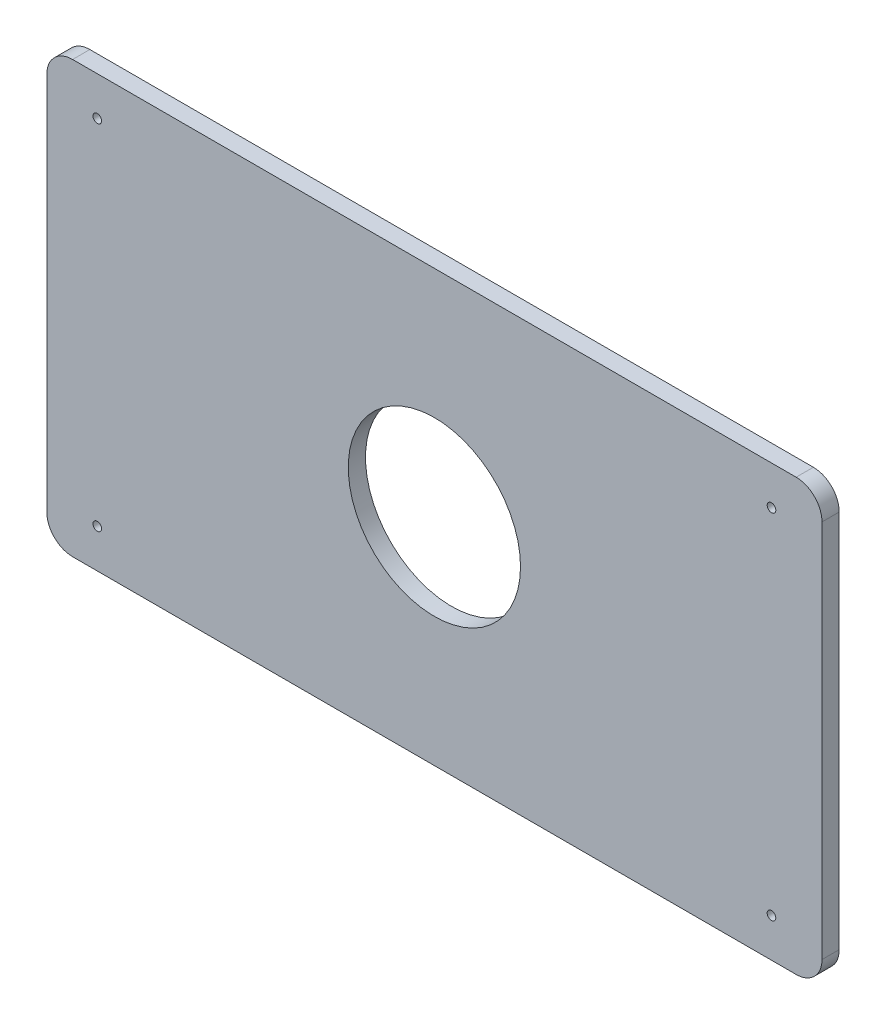
ISO-10303-21;
HEADER;
FILE_DESCRIPTION(('STEP AP214'),'2;1');
FILE_NAME('part.step','',(''),(''),'','','');
FILE_SCHEMA(('AUTOMOTIVE_DESIGN { 1 0 10303 214 1 1 1 1 }'));
ENDSEC;
DATA;
#1=APPLICATION_CONTEXT('core data for automotive mechanical design processes');
#2=APPLICATION_PROTOCOL_DEFINITION('international standard','automotive_design',2000,#1);
#3=PRODUCT_CONTEXT('',#1,'mechanical');
#4=PRODUCT('Part','Part','',(#3));
#5=PRODUCT_RELATED_PRODUCT_CATEGORY('part','',(#4));
#6=PRODUCT_DEFINITION_FORMATION('','',#4);
#7=PRODUCT_DEFINITION_CONTEXT('part definition',#1,'design');
#8=PRODUCT_DEFINITION('design','',#6,#7);
#9=PRODUCT_DEFINITION_SHAPE('','',#8);
#10=(LENGTH_UNIT() NAMED_UNIT(*) SI_UNIT(.MILLI.,.METRE.));
#11=(NAMED_UNIT(*) PLANE_ANGLE_UNIT() SI_UNIT($,.RADIAN.));
#12=(NAMED_UNIT(*) SI_UNIT($,.STERADIAN.) SOLID_ANGLE_UNIT());
#13=UNCERTAINTY_MEASURE_WITH_UNIT(LENGTH_MEASURE(1.E-05),#10,'distance_accuracy_value','');
#14=(GEOMETRIC_REPRESENTATION_CONTEXT(3) GLOBAL_UNCERTAINTY_ASSIGNED_CONTEXT((#13)) GLOBAL_UNIT_ASSIGNED_CONTEXT((#10,
#11,#12)) REPRESENTATION_CONTEXT('',''));
#15=CARTESIAN_POINT('',(0.,0.,0.));
#16=DIRECTION('',(0.,0.,1.));
#17=DIRECTION('',(1.,0.,0.));
#18=AXIS2_PLACEMENT_3D('',#15,#16,#17);
#19=CARTESIAN_POINT('',(435.,235.,10.));
#20=DIRECTION('',(0.,0.,-1.));
#21=DIRECTION('',(-1.,0.,0.));
#22=AXIS2_PLACEMENT_3D('',#19,#20,#21);
#23=PLANE('',#22);
#24=CARTESIAN_POINT('',(29.3181818181816,22.5,10.));
#25=DIRECTION('',(0.,0.,1.));
#26=DIRECTION('',(-1.,0.,0.));
#27=AXIS2_PLACEMENT_3D('',#24,#25,#26);
#28=CIRCLE('',#27,2.50000000000002);
#29=CARTESIAN_POINT('',(26.8181818181816,22.5,10.));
#30=VERTEX_POINT('',#29);
#31=EDGE_CURVE('E197',#30,#30,#28,.T.);
#32=ORIENTED_EDGE('',*,*,#31,.F.);
#33=EDGE_LOOP('',(#32));
#34=FACE_BOUND('',#33,.T.);
#35=CARTESIAN_POINT('',(29.3181818181817,227.5,10.));
#36=DIRECTION('',(0.,0.,1.));
#37=DIRECTION('',(-1.,0.,0.));
#38=AXIS2_PLACEMENT_3D('',#35,#36,#37);
#39=CIRCLE('',#38,2.50000000000002);
#40=CARTESIAN_POINT('',(26.8181818181817,227.5,10.));
#41=VERTEX_POINT('',#40);
#42=EDGE_CURVE('E203',#41,#41,#39,.T.);
#43=ORIENTED_EDGE('',*,*,#42,.F.);
#44=EDGE_LOOP('',(#43));
#45=FACE_BOUND('',#44,.T.);
#46=CARTESIAN_POINT('',(420.681818181818,227.5,10.));
#47=DIRECTION('',(0.,0.,1.));
#48=DIRECTION('',(1.,0.,0.));
#49=AXIS2_PLACEMENT_3D('',#46,#47,#48);
#50=CIRCLE('',#49,2.50000000000002);
#51=CARTESIAN_POINT('',(423.181818181818,227.5,10.));
#52=VERTEX_POINT('',#51);
#53=EDGE_CURVE('E209',#52,#52,#50,.T.);
#54=ORIENTED_EDGE('',*,*,#53,.F.);
#55=EDGE_LOOP('',(#54));
#56=FACE_BOUND('',#55,.T.);
#57=CARTESIAN_POINT('',(420.681818181818,22.4999999999999,10.));
#58=DIRECTION('',(0.,0.,1.));
#59=DIRECTION('',(1.,0.,0.));
#60=AXIS2_PLACEMENT_3D('',#57,#58,#59);
#61=CIRCLE('',#60,2.50000000000002);
#62=CARTESIAN_POINT('',(423.181818181818,22.4999999999999,10.));
#63=VERTEX_POINT('',#62);
#64=EDGE_CURVE('E191',#63,#63,#61,.T.);
#65=ORIENTED_EDGE('',*,*,#64,.F.);
#66=EDGE_LOOP('',(#65));
#67=FACE_BOUND('',#66,.T.);
#68=CARTESIAN_POINT('',(435.,235.,10.));
#69=DIRECTION('',(0.,0.,1.));
#70=DIRECTION('',(-1.,0.,0.));
#71=AXIS2_PLACEMENT_3D('',#68,#69,#70);
#72=CIRCLE('',#71,15.);
#73=CARTESIAN_POINT('',(450.,235.,10.));
#74=VERTEX_POINT('',#73);
#75=CARTESIAN_POINT('',(435.,250.,10.));
#76=VERTEX_POINT('',#75);
#77=EDGE_CURVE('E151',#74,#76,#72,.T.);
#78=ORIENTED_EDGE('',*,*,#77,.T.);
#79=DIRECTION('',(-1.,0.,0.));
#80=VECTOR('',#79,1.);
#81=CARTESIAN_POINT('',(15.,250.,10.));
#82=LINE('',#81,#80);
#83=CARTESIAN_POINT('',(15.,250.,10.));
#84=VERTEX_POINT('',#83);
#85=EDGE_CURVE('E99',#76,#84,#82,.T.);
#86=ORIENTED_EDGE('',*,*,#85,.T.);
#87=CARTESIAN_POINT('',(15.,235.,10.));
#88=DIRECTION('',(0.,0.,1.));
#89=DIRECTION('',(-1.,0.,0.));
#90=AXIS2_PLACEMENT_3D('',#87,#88,#89);
#91=CIRCLE('',#90,15.);
#92=CARTESIAN_POINT('',(0.,235.,10.));
#93=VERTEX_POINT('',#92);
#94=EDGE_CURVE('E166',#84,#93,#91,.T.);
#95=ORIENTED_EDGE('',*,*,#94,.T.);
#96=DIRECTION('',(0.,-1.,0.));
#97=VECTOR('',#96,1.);
#98=CARTESIAN_POINT('',(0.,15.0000000000001,10.));
#99=LINE('',#98,#97);
#100=CARTESIAN_POINT('',(0.,15.0000000000001,10.));
#101=VERTEX_POINT('',#100);
#102=EDGE_CURVE('E179',#93,#101,#99,.T.);
#103=ORIENTED_EDGE('',*,*,#102,.T.);
#104=CARTESIAN_POINT('',(15.,15.,10.));
#105=DIRECTION('',(0.,0.,1.));
#106=DIRECTION('',(-1.,0.,0.));
#107=AXIS2_PLACEMENT_3D('',#104,#105,#106);
#108=CIRCLE('',#107,15.);
#109=CARTESIAN_POINT('',(15.0000000000001,0.,10.));
#110=VERTEX_POINT('',#109);
#111=EDGE_CURVE('E118',#101,#110,#108,.T.);
#112=ORIENTED_EDGE('',*,*,#111,.T.);
#113=DIRECTION('',(1.,0.,0.));
#114=VECTOR('',#113,1.);
#115=CARTESIAN_POINT('',(15.0000000000001,0.,10.));
#116=LINE('',#115,#114);
#117=CARTESIAN_POINT('',(435.,0.,10.));
#118=VERTEX_POINT('',#117);
#119=EDGE_CURVE('E112',#110,#118,#116,.T.);
#120=ORIENTED_EDGE('',*,*,#119,.T.);
#121=CARTESIAN_POINT('',(435.,15.,10.));
#122=DIRECTION('',(0.,0.,1.));
#123=DIRECTION('',(1.,0.,0.));
#124=AXIS2_PLACEMENT_3D('',#121,#122,#123);
#125=CIRCLE('',#124,15.);
#126=CARTESIAN_POINT('',(450.,15.,10.));
#127=VERTEX_POINT('',#126);
#128=EDGE_CURVE('E116',#118,#127,#125,.T.);
#129=ORIENTED_EDGE('',*,*,#128,.T.);
#130=DIRECTION('',(0.,1.,0.));
#131=VECTOR('',#130,1.);
#132=CARTESIAN_POINT('',(450.,15.,10.));
#133=LINE('',#132,#131);
#134=EDGE_CURVE('E56',#127,#74,#133,.T.);
#135=ORIENTED_EDGE('',*,*,#134,.T.);
#136=EDGE_LOOP('',(#78,#86,#95,#103,#112,#120,#129,#135));
#137=FACE_BOUND('',#136,.T.);
#138=CARTESIAN_POINT('',(225.,125.,10.));
#139=DIRECTION('',(0.,0.,1.));
#140=DIRECTION('',(1.,0.,0.));
#141=AXIS2_PLACEMENT_3D('',#138,#139,#140);
#142=CIRCLE('',#141,50.);
#143=CARTESIAN_POINT('',(275.,125.,10.));
#144=VERTEX_POINT('',#143);
#145=EDGE_CURVE('E140',#144,#144,#142,.T.);
#146=ORIENTED_EDGE('',*,*,#145,.F.);
#147=EDGE_LOOP('',(#146));
#148=FACE_BOUND('',#147,.T.);
#149=ADVANCED_FACE('F39',(#34,#45,#56,#67,#137,#148),#23,.F.);
#150=CARTESIAN_POINT('',(435.,235.,0.));
#151=DIRECTION('',(0.,0.,-1.));
#152=DIRECTION('',(-1.,0.,0.));
#153=AXIS2_PLACEMENT_3D('',#150,#151,#152);
#154=PLANE('',#153);
#155=CARTESIAN_POINT('',(29.3181818181816,22.5,0.));
#156=DIRECTION('',(0.,0.,1.));
#157=DIRECTION('',(-1.,0.,0.));
#158=AXIS2_PLACEMENT_3D('',#155,#156,#157);
#159=CIRCLE('',#158,2.50000000000002);
#160=CARTESIAN_POINT('',(26.8181818181816,22.5,0.));
#161=VERTEX_POINT('',#160);
#162=EDGE_CURVE('E200',#161,#161,#159,.T.);
#163=ORIENTED_EDGE('',*,*,#162,.T.);
#164=EDGE_LOOP('',(#163));
#165=FACE_BOUND('',#164,.T.);
#166=CARTESIAN_POINT('',(29.3181818181817,227.5,0.));
#167=DIRECTION('',(0.,0.,1.));
#168=DIRECTION('',(-1.,0.,0.));
#169=AXIS2_PLACEMENT_3D('',#166,#167,#168);
#170=CIRCLE('',#169,2.50000000000002);
#171=CARTESIAN_POINT('',(26.8181818181817,227.5,0.));
#172=VERTEX_POINT('',#171);
#173=EDGE_CURVE('E206',#172,#172,#170,.T.);
#174=ORIENTED_EDGE('',*,*,#173,.T.);
#175=EDGE_LOOP('',(#174));
#176=FACE_BOUND('',#175,.T.);
#177=CARTESIAN_POINT('',(420.681818181818,227.5,0.));
#178=DIRECTION('',(0.,0.,1.));
#179=DIRECTION('',(1.,0.,0.));
#180=AXIS2_PLACEMENT_3D('',#177,#178,#179);
#181=CIRCLE('',#180,2.50000000000002);
#182=CARTESIAN_POINT('',(423.181818181818,227.5,0.));
#183=VERTEX_POINT('',#182);
#184=EDGE_CURVE('E194',#183,#183,#181,.T.);
#185=ORIENTED_EDGE('',*,*,#184,.T.);
#186=EDGE_LOOP('',(#185));
#187=FACE_BOUND('',#186,.T.);
#188=CARTESIAN_POINT('',(420.681818181818,22.4999999999999,0.));
#189=DIRECTION('',(0.,0.,1.));
#190=DIRECTION('',(1.,0.,0.));
#191=AXIS2_PLACEMENT_3D('',#188,#189,#190);
#192=CIRCLE('',#191,2.50000000000002);
#193=CARTESIAN_POINT('',(423.181818181818,22.4999999999999,0.));
#194=VERTEX_POINT('',#193);
#195=EDGE_CURVE('E188',#194,#194,#192,.T.);
#196=ORIENTED_EDGE('',*,*,#195,.T.);
#197=EDGE_LOOP('',(#196));
#198=FACE_BOUND('',#197,.T.);
#199=CARTESIAN_POINT('',(435.,235.,0.));
#200=DIRECTION('',(0.,0.,1.));
#201=DIRECTION('',(-1.,0.,0.));
#202=AXIS2_PLACEMENT_3D('',#199,#200,#201);
#203=CIRCLE('',#202,15.);
#204=CARTESIAN_POINT('',(450.,235.,0.));
#205=VERTEX_POINT('',#204);
#206=CARTESIAN_POINT('',(435.,250.,0.));
#207=VERTEX_POINT('',#206);
#208=EDGE_CURVE('E136',#205,#207,#203,.T.);
#209=ORIENTED_EDGE('',*,*,#208,.F.);
#210=DIRECTION('',(0.,1.,0.));
#211=VECTOR('',#210,1.);
#212=CARTESIAN_POINT('',(450.,15.,0.));
#213=LINE('',#212,#211);
#214=CARTESIAN_POINT('',(450.,15.,0.));
#215=VERTEX_POINT('',#214);
#216=EDGE_CURVE('E91',#215,#205,#213,.T.);
#217=ORIENTED_EDGE('',*,*,#216,.F.);
#218=CARTESIAN_POINT('',(435.,15.,0.));
#219=DIRECTION('',(0.,0.,1.));
#220=DIRECTION('',(1.,0.,0.));
#221=AXIS2_PLACEMENT_3D('',#218,#219,#220);
#222=CIRCLE('',#221,15.);
#223=CARTESIAN_POINT('',(435.,0.,0.));
#224=VERTEX_POINT('',#223);
#225=EDGE_CURVE('E85',#224,#215,#222,.T.);
#226=ORIENTED_EDGE('',*,*,#225,.F.);
#227=DIRECTION('',(1.,0.,0.));
#228=VECTOR('',#227,1.);
#229=CARTESIAN_POINT('',(15.0000000000001,0.,0.));
#230=LINE('',#229,#228);
#231=CARTESIAN_POINT('',(15.0000000000001,0.,0.));
#232=VERTEX_POINT('',#231);
#233=EDGE_CURVE('E126',#232,#224,#230,.T.);
#234=ORIENTED_EDGE('',*,*,#233,.F.);
#235=CARTESIAN_POINT('',(15.,15.,0.));
#236=DIRECTION('',(0.,0.,1.));
#237=DIRECTION('',(-1.,0.,0.));
#238=AXIS2_PLACEMENT_3D('',#235,#236,#237);
#239=CIRCLE('',#238,15.);
#240=CARTESIAN_POINT('',(0.,15.0000000000001,0.));
#241=VERTEX_POINT('',#240);
#242=EDGE_CURVE('E146',#241,#232,#239,.T.);
#243=ORIENTED_EDGE('',*,*,#242,.F.);
#244=DIRECTION('',(0.,-1.,0.));
#245=VECTOR('',#244,1.);
#246=CARTESIAN_POINT('',(0.,15.0000000000001,0.));
#247=LINE('',#246,#245);
#248=CARTESIAN_POINT('',(0.,235.,0.));
#249=VERTEX_POINT('',#248);
#250=EDGE_CURVE('E144',#249,#241,#247,.T.);
#251=ORIENTED_EDGE('',*,*,#250,.F.);
#252=CARTESIAN_POINT('',(15.,235.,0.));
#253=DIRECTION('',(0.,0.,1.));
#254=DIRECTION('',(-1.,0.,0.));
#255=AXIS2_PLACEMENT_3D('',#252,#253,#254);
#256=CIRCLE('',#255,15.);
#257=CARTESIAN_POINT('',(15.,250.,0.));
#258=VERTEX_POINT('',#257);
#259=EDGE_CURVE('E142',#258,#249,#256,.T.);
#260=ORIENTED_EDGE('',*,*,#259,.F.);
#261=DIRECTION('',(-1.,0.,0.));
#262=VECTOR('',#261,1.);
#263=CARTESIAN_POINT('',(15.,250.,0.));
#264=LINE('',#263,#262);
#265=EDGE_CURVE('E139',#207,#258,#264,.T.);
#266=ORIENTED_EDGE('',*,*,#265,.F.);
#267=EDGE_LOOP('',(#209,#217,#226,#234,#243,#251,#260,#266));
#268=FACE_BOUND('',#267,.T.);
#269=CARTESIAN_POINT('',(225.,125.,0.));
#270=DIRECTION('',(0.,0.,1.));
#271=DIRECTION('',(1.,0.,0.));
#272=AXIS2_PLACEMENT_3D('',#269,#270,#271);
#273=CIRCLE('',#272,50.);
#274=CARTESIAN_POINT('',(275.,125.,0.));
#275=VERTEX_POINT('',#274);
#276=EDGE_CURVE('E185',#275,#275,#273,.T.);
#277=ORIENTED_EDGE('',*,*,#276,.T.);
#278=EDGE_LOOP('',(#277));
#279=FACE_BOUND('',#278,.T.);
#280=ADVANCED_FACE('F170',(#165,#176,#187,#198,#268,#279),#154,.T.);
#281=CARTESIAN_POINT('',(435.,235.,10.));
#282=DIRECTION('',(0.,0.,-1.));
#283=DIRECTION('',(-1.,0.,0.));
#284=AXIS2_PLACEMENT_3D('',#281,#282,#283);
#285=CYLINDRICAL_SURFACE('',#284,15.);
#286=ORIENTED_EDGE('',*,*,#208,.T.);
#287=DIRECTION('',(0.,0.,-1.));
#288=VECTOR('',#287,1.);
#289=CARTESIAN_POINT('',(435.,250.,10.));
#290=LINE('',#289,#288);
#291=EDGE_CURVE('E11',#76,#207,#290,.T.);
#292=ORIENTED_EDGE('',*,*,#291,.F.);
#293=ORIENTED_EDGE('',*,*,#77,.F.);
#294=DIRECTION('',(0.,0.,-1.));
#295=VECTOR('',#294,1.);
#296=CARTESIAN_POINT('',(450.,235.,10.));
#297=LINE('',#296,#295);
#298=EDGE_CURVE('E132',#74,#205,#297,.T.);
#299=ORIENTED_EDGE('',*,*,#298,.T.);
#300=EDGE_LOOP('',(#286,#292,#293,#299));
#301=FACE_BOUND('',#300,.T.);
#302=ADVANCED_FACE('F41',(#301),#285,.T.);
#303=CARTESIAN_POINT('',(15.,250.,10.));
#304=DIRECTION('',(0.,-1.,0.));
#305=DIRECTION('',(0.,0.,-1.));
#306=AXIS2_PLACEMENT_3D('',#303,#304,#305);
#307=PLANE('',#306);
#308=ORIENTED_EDGE('',*,*,#265,.T.);
#309=DIRECTION('',(0.,0.,-1.));
#310=VECTOR('',#309,1.);
#311=CARTESIAN_POINT('',(15.,250.,10.));
#312=LINE('',#311,#310);
#313=EDGE_CURVE('E48',#84,#258,#312,.T.);
#314=ORIENTED_EDGE('',*,*,#313,.F.);
#315=ORIENTED_EDGE('',*,*,#85,.F.);
#316=ORIENTED_EDGE('',*,*,#291,.T.);
#317=EDGE_LOOP('',(#308,#314,#315,#316));
#318=FACE_BOUND('',#317,.T.);
#319=ADVANCED_FACE('F260',(#318),#307,.F.);
#320=CARTESIAN_POINT('',(15.,235.,10.));
#321=DIRECTION('',(0.,0.,-1.));
#322=DIRECTION('',(-1.,0.,0.));
#323=AXIS2_PLACEMENT_3D('',#320,#321,#322);
#324=CYLINDRICAL_SURFACE('',#323,15.);
#325=ORIENTED_EDGE('',*,*,#259,.T.);
#326=DIRECTION('',(0.,0.,-1.));
#327=VECTOR('',#326,1.);
#328=CARTESIAN_POINT('',(0.,235.,10.));
#329=LINE('',#328,#327);
#330=EDGE_CURVE('E158',#93,#249,#329,.T.);
#331=ORIENTED_EDGE('',*,*,#330,.F.);
#332=ORIENTED_EDGE('',*,*,#94,.F.);
#333=ORIENTED_EDGE('',*,*,#313,.T.);
#334=EDGE_LOOP('',(#325,#331,#332,#333));
#335=FACE_BOUND('',#334,.T.);
#336=ADVANCED_FACE('F164',(#335),#324,.T.);
#337=CARTESIAN_POINT('',(0.,15.0000000000001,10.));
#338=DIRECTION('',(1.,0.,0.));
#339=DIRECTION('',(0.,0.,-1.));
#340=AXIS2_PLACEMENT_3D('',#337,#338,#339);
#341=PLANE('',#340);
#342=ORIENTED_EDGE('',*,*,#250,.T.);
#343=DIRECTION('',(0.,0.,-1.));
#344=VECTOR('',#343,1.);
#345=CARTESIAN_POINT('',(0.,15.0000000000001,10.));
#346=LINE('',#345,#344);
#347=EDGE_CURVE('E155',#101,#241,#346,.T.);
#348=ORIENTED_EDGE('',*,*,#347,.F.);
#349=ORIENTED_EDGE('',*,*,#102,.F.);
#350=ORIENTED_EDGE('',*,*,#330,.T.);
#351=EDGE_LOOP('',(#342,#348,#349,#350));
#352=FACE_BOUND('',#351,.T.);
#353=ADVANCED_FACE('F175',(#352),#341,.F.);
#354=CARTESIAN_POINT('',(15.,15.,10.));
#355=DIRECTION('',(0.,0.,-1.));
#356=DIRECTION('',(-1.,0.,0.));
#357=AXIS2_PLACEMENT_3D('',#354,#355,#356);
#358=CYLINDRICAL_SURFACE('',#357,15.);
#359=ORIENTED_EDGE('',*,*,#242,.T.);
#360=DIRECTION('',(0.,0.,-1.));
#361=VECTOR('',#360,1.);
#362=CARTESIAN_POINT('',(15.0000000000001,0.,10.));
#363=LINE('',#362,#361);
#364=EDGE_CURVE('E127',#110,#232,#363,.T.);
#365=ORIENTED_EDGE('',*,*,#364,.F.);
#366=ORIENTED_EDGE('',*,*,#111,.F.);
#367=ORIENTED_EDGE('',*,*,#347,.T.);
#368=EDGE_LOOP('',(#359,#365,#366,#367));
#369=FACE_BOUND('',#368,.T.);
#370=ADVANCED_FACE('F178',(#369),#358,.T.);
#371=CARTESIAN_POINT('',(15.0000000000001,0.,10.));
#372=DIRECTION('',(0.,1.,0.));
#373=DIRECTION('',(-1.,0.,0.));
#374=AXIS2_PLACEMENT_3D('',#371,#372,#373);
#375=PLANE('',#374);
#376=ORIENTED_EDGE('',*,*,#233,.T.);
#377=DIRECTION('',(0.,0.,-1.));
#378=VECTOR('',#377,1.);
#379=CARTESIAN_POINT('',(435.,0.,10.));
#380=LINE('',#379,#378);
#381=EDGE_CURVE('E123',#118,#224,#380,.T.);
#382=ORIENTED_EDGE('',*,*,#381,.F.);
#383=ORIENTED_EDGE('',*,*,#119,.F.);
#384=ORIENTED_EDGE('',*,*,#364,.T.);
#385=EDGE_LOOP('',(#376,#382,#383,#384));
#386=FACE_BOUND('',#385,.T.);
#387=ADVANCED_FACE('F124',(#386),#375,.F.);
#388=CARTESIAN_POINT('',(435.,15.,10.));
#389=DIRECTION('',(0.,0.,-1.));
#390=DIRECTION('',(-1.,0.,0.));
#391=AXIS2_PLACEMENT_3D('',#388,#389,#390);
#392=CYLINDRICAL_SURFACE('',#391,15.);
#393=ORIENTED_EDGE('',*,*,#225,.T.);
#394=DIRECTION('',(0.,0.,-1.));
#395=VECTOR('',#394,1.);
#396=CARTESIAN_POINT('',(450.,15.,10.));
#397=LINE('',#396,#395);
#398=EDGE_CURVE('E128',#127,#215,#397,.T.);
#399=ORIENTED_EDGE('',*,*,#398,.F.);
#400=ORIENTED_EDGE('',*,*,#128,.F.);
#401=ORIENTED_EDGE('',*,*,#381,.T.);
#402=EDGE_LOOP('',(#393,#399,#400,#401));
#403=FACE_BOUND('',#402,.T.);
#404=ADVANCED_FACE('F130',(#403),#392,.T.);
#405=CARTESIAN_POINT('',(450.,15.,10.));
#406=DIRECTION('',(-1.,0.,0.));
#407=DIRECTION('',(0.,0.,1.));
#408=AXIS2_PLACEMENT_3D('',#405,#406,#407);
#409=PLANE('',#408);
#410=ORIENTED_EDGE('',*,*,#216,.T.);
#411=ORIENTED_EDGE('',*,*,#298,.F.);
#412=ORIENTED_EDGE('',*,*,#134,.F.);
#413=ORIENTED_EDGE('',*,*,#398,.T.);
#414=EDGE_LOOP('',(#410,#411,#412,#413));
#415=FACE_BOUND('',#414,.T.);
#416=ADVANCED_FACE('F238',(#415),#409,.F.);
#417=CARTESIAN_POINT('',(225.,125.,10.));
#418=DIRECTION('',(0.,0.,-1.));
#419=DIRECTION('',(-1.,0.,0.));
#420=AXIS2_PLACEMENT_3D('',#417,#418,#419);
#421=CYLINDRICAL_SURFACE('',#420,50.);
#422=ORIENTED_EDGE('',*,*,#145,.T.);
#423=EDGE_LOOP('',(#422));
#424=FACE_BOUND('',#423,.T.);
#425=ORIENTED_EDGE('',*,*,#276,.F.);
#426=EDGE_LOOP('',(#425));
#427=FACE_BOUND('',#426,.T.);
#428=ADVANCED_FACE('F232',(#424,#427),#421,.F.);
#429=CARTESIAN_POINT('',(420.681818181818,22.4999999999999,0.));
#430=DIRECTION('',(0.,0.,1.));
#431=DIRECTION('',(1.,0.,0.));
#432=AXIS2_PLACEMENT_3D('',#429,#430,#431);
#433=CYLINDRICAL_SURFACE('',#432,2.50000000000002);
#434=ORIENTED_EDGE('',*,*,#195,.F.);
#435=EDGE_LOOP('',(#434));
#436=FACE_BOUND('',#435,.T.);
#437=ORIENTED_EDGE('',*,*,#64,.T.);
#438=EDGE_LOOP('',(#437));
#439=FACE_BOUND('',#438,.T.);
#440=ADVANCED_FACE('F221',(#436,#439),#433,.F.);
#441=CARTESIAN_POINT('',(420.681818181818,227.5,0.));
#442=DIRECTION('',(0.,0.,1.));
#443=DIRECTION('',(1.,0.,0.));
#444=AXIS2_PLACEMENT_3D('',#441,#442,#443);
#445=CYLINDRICAL_SURFACE('',#444,2.50000000000002);
#446=ORIENTED_EDGE('',*,*,#184,.F.);
#447=EDGE_LOOP('',(#446));
#448=FACE_BOUND('',#447,.T.);
#449=ORIENTED_EDGE('',*,*,#53,.T.);
#450=EDGE_LOOP('',(#449));
#451=FACE_BOUND('',#450,.T.);
#452=ADVANCED_FACE('F217',(#448,#451),#445,.F.);
#453=CARTESIAN_POINT('',(29.3181818181817,227.5,0.));
#454=DIRECTION('',(0.,0.,1.));
#455=DIRECTION('',(1.,0.,0.));
#456=AXIS2_PLACEMENT_3D('',#453,#454,#455);
#457=CYLINDRICAL_SURFACE('',#456,2.50000000000002);
#458=ORIENTED_EDGE('',*,*,#173,.F.);
#459=EDGE_LOOP('',(#458));
#460=FACE_BOUND('',#459,.T.);
#461=ORIENTED_EDGE('',*,*,#42,.T.);
#462=EDGE_LOOP('',(#461));
#463=FACE_BOUND('',#462,.T.);
#464=ADVANCED_FACE('F220',(#460,#463),#457,.F.);
#465=CARTESIAN_POINT('',(29.3181818181816,22.5,0.));
#466=DIRECTION('',(0.,0.,1.));
#467=DIRECTION('',(1.,0.,0.));
#468=AXIS2_PLACEMENT_3D('',#465,#466,#467);
#469=CYLINDRICAL_SURFACE('',#468,2.50000000000002);
#470=ORIENTED_EDGE('',*,*,#162,.F.);
#471=EDGE_LOOP('',(#470));
#472=FACE_BOUND('',#471,.T.);
#473=ORIENTED_EDGE('',*,*,#31,.T.);
#474=EDGE_LOOP('',(#473));
#475=FACE_BOUND('',#474,.T.);
#476=ADVANCED_FACE('F243',(#472,#475),#469,.F.);
#477=CLOSED_SHELL('',(#149,#280,#302,#319,#336,#353,#370,#387,#404,#416,#428,#440,#452,#464,#476));
#478=MANIFOLD_SOLID_BREP('B2',#477);
#479=ADVANCED_BREP_SHAPE_REPRESENTATION('',(#18,#478),#14);
#480=SHAPE_DEFINITION_REPRESENTATION(#9,#479);
ENDSEC;
END-ISO-10303-21;
